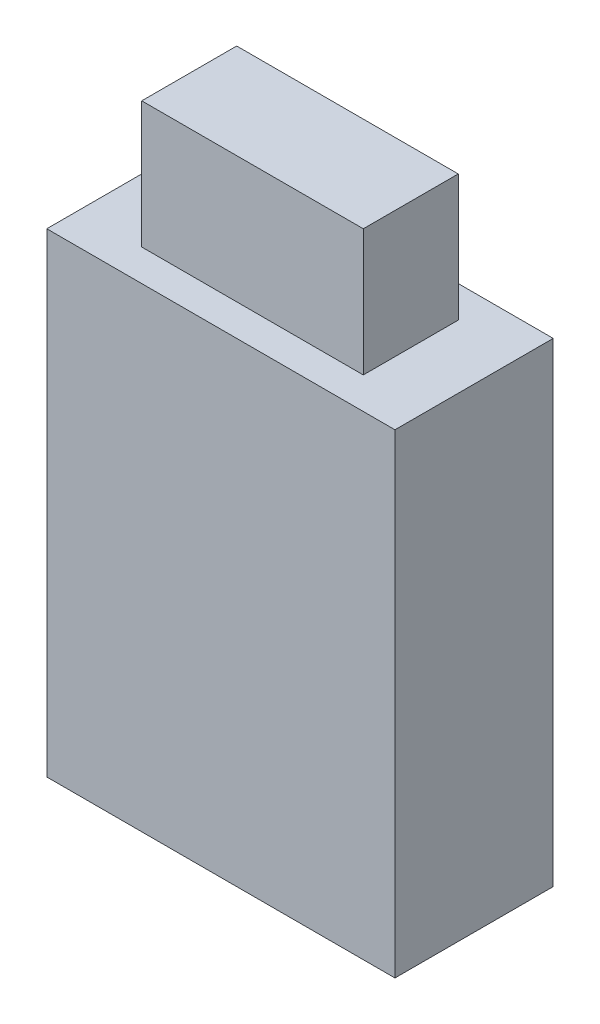
ISO-10303-21;
HEADER;
FILE_DESCRIPTION(('STEP AP214'),'2;1');
FILE_NAME('part.step','',(''),(''),'','','');
FILE_SCHEMA(('AUTOMOTIVE_DESIGN { 1 0 10303 214 1 1 1 1 }'));
ENDSEC;
DATA;
#1=APPLICATION_CONTEXT('core data for automotive mechanical design processes');
#2=APPLICATION_PROTOCOL_DEFINITION('international standard','automotive_design',2000,#1);
#3=PRODUCT_CONTEXT('',#1,'mechanical');
#4=PRODUCT('Part','Part','',(#3));
#5=PRODUCT_RELATED_PRODUCT_CATEGORY('part','',(#4));
#6=PRODUCT_DEFINITION_FORMATION('','',#4);
#7=PRODUCT_DEFINITION_CONTEXT('part definition',#1,'design');
#8=PRODUCT_DEFINITION('design','',#6,#7);
#9=PRODUCT_DEFINITION_SHAPE('','',#8);
#10=(LENGTH_UNIT() NAMED_UNIT(*) SI_UNIT(.MILLI.,.METRE.));
#11=(NAMED_UNIT(*) PLANE_ANGLE_UNIT() SI_UNIT($,.RADIAN.));
#12=(NAMED_UNIT(*) SI_UNIT($,.STERADIAN.) SOLID_ANGLE_UNIT());
#13=UNCERTAINTY_MEASURE_WITH_UNIT(LENGTH_MEASURE(1.E-05),#10,'distance_accuracy_value','');
#14=(GEOMETRIC_REPRESENTATION_CONTEXT(3) GLOBAL_UNCERTAINTY_ASSIGNED_CONTEXT((#13)) GLOBAL_UNIT_ASSIGNED_CONTEXT((#10,
#11,#12)) REPRESENTATION_CONTEXT('',''));
#15=CARTESIAN_POINT('',(0.,0.,0.));
#16=DIRECTION('',(0.,0.,1.));
#17=DIRECTION('',(1.,0.,0.));
#18=AXIS2_PLACEMENT_3D('',#15,#16,#17);
#19=CARTESIAN_POINT('',(30.,158.,66.));
#20=DIRECTION('',(1.,0.,0.));
#21=DIRECTION('',(0.,0.,-1.));
#22=AXIS2_PLACEMENT_3D('',#19,#20,#21);
#23=PLANE('',#22);
#24=DIRECTION('',(0.,-1.,0.));
#25=VECTOR('',#24,1.);
#26=CARTESIAN_POINT('',(30.,158.,56.));
#27=LINE('',#26,#25);
#28=CARTESIAN_POINT('',(30.,188.,56.));
#29=VERTEX_POINT('',#28);
#30=CARTESIAN_POINT('',(30.,158.,56.));
#31=VERTEX_POINT('',#30);
#32=EDGE_CURVE('E130',#29,#31,#27,.T.);
#33=ORIENTED_EDGE('',*,*,#32,.T.);
#34=DIRECTION('',(0.,0.,-1.));
#35=VECTOR('',#34,1.);
#36=CARTESIAN_POINT('',(30.,158.,66.));
#37=LINE('',#36,#35);
#38=CARTESIAN_POINT('',(30.,158.,66.));
#39=VERTEX_POINT('',#38);
#40=EDGE_CURVE('E11',#39,#31,#37,.T.);
#41=ORIENTED_EDGE('',*,*,#40,.F.);
#42=DIRECTION('',(0.,-1.,0.));
#43=VECTOR('',#42,1.);
#44=CARTESIAN_POINT('',(30.,158.,66.));
#45=LINE('',#44,#43);
#46=CARTESIAN_POINT('',(30.,188.,66.));
#47=VERTEX_POINT('',#46);
#48=EDGE_CURVE('E152',#47,#39,#45,.T.);
#49=ORIENTED_EDGE('',*,*,#48,.F.);
#50=DIRECTION('',(0.,0.,-1.));
#51=VECTOR('',#50,1.);
#52=CARTESIAN_POINT('',(30.,188.,66.));
#53=LINE('',#52,#51);
#54=EDGE_CURVE('E158',#47,#29,#53,.T.);
#55=ORIENTED_EDGE('',*,*,#54,.T.);
#56=EDGE_LOOP('',(#33,#41,#49,#55));
#57=FACE_BOUND('',#56,.T.);
#58=ADVANCED_FACE('F41',(#57),#23,.F.);
#59=CARTESIAN_POINT('',(30.,158.,66.));
#60=DIRECTION('',(0.,1.,0.));
#61=DIRECTION('',(0.,0.,1.));
#62=AXIS2_PLACEMENT_3D('',#59,#60,#61);
#63=PLANE('',#62);
#64=DIRECTION('',(1.,0.,0.));
#65=VECTOR('',#64,1.);
#66=CARTESIAN_POINT('',(30.,158.,56.));
#67=LINE('',#66,#65);
#68=CARTESIAN_POINT('',(52.,158.,56.));
#69=VERTEX_POINT('',#68);
#70=EDGE_CURVE('E161',#31,#69,#67,.T.);
#71=ORIENTED_EDGE('',*,*,#70,.T.);
#72=DIRECTION('',(0.,0.,-1.));
#73=VECTOR('',#72,1.);
#74=CARTESIAN_POINT('',(52.,158.,66.));
#75=LINE('',#74,#73);
#76=CARTESIAN_POINT('',(52.,158.,66.));
#77=VERTEX_POINT('',#76);
#78=EDGE_CURVE('E48',#77,#69,#75,.T.);
#79=ORIENTED_EDGE('',*,*,#78,.F.);
#80=DIRECTION('',(1.,0.,0.));
#81=VECTOR('',#80,1.);
#82=CARTESIAN_POINT('',(30.,158.,66.));
#83=LINE('',#82,#81);
#84=EDGE_CURVE('E92',#39,#77,#83,.T.);
#85=ORIENTED_EDGE('',*,*,#84,.F.);
#86=ORIENTED_EDGE('',*,*,#40,.T.);
#87=EDGE_LOOP('',(#71,#79,#85,#86));
#88=FACE_BOUND('',#87,.T.);
#89=ADVANCED_FACE('F190',(#88),#63,.F.);
#90=CARTESIAN_POINT('',(52.,158.,66.));
#91=DIRECTION('',(-1.,0.,0.));
#92=DIRECTION('',(0.,0.,1.));
#93=AXIS2_PLACEMENT_3D('',#90,#91,#92);
#94=PLANE('',#93);
#95=DIRECTION('',(0.,1.,0.));
#96=VECTOR('',#95,1.);
#97=CARTESIAN_POINT('',(52.,158.,56.));
#98=LINE('',#97,#96);
#99=CARTESIAN_POINT('',(52.,188.,56.));
#100=VERTEX_POINT('',#99);
#101=EDGE_CURVE('E163',#69,#100,#98,.T.);
#102=ORIENTED_EDGE('',*,*,#101,.T.);
#103=DIRECTION('',(0.,0.,-1.));
#104=VECTOR('',#103,1.);
#105=CARTESIAN_POINT('',(52.,188.,66.));
#106=LINE('',#105,#104);
#107=CARTESIAN_POINT('',(52.,188.,66.));
#108=VERTEX_POINT('',#107);
#109=EDGE_CURVE('E167',#108,#100,#106,.T.);
#110=ORIENTED_EDGE('',*,*,#109,.F.);
#111=DIRECTION('',(0.,1.,0.));
#112=VECTOR('',#111,1.);
#113=CARTESIAN_POINT('',(52.,158.,66.));
#114=LINE('',#113,#112);
#115=EDGE_CURVE('E155',#77,#108,#114,.T.);
#116=ORIENTED_EDGE('',*,*,#115,.F.);
#117=ORIENTED_EDGE('',*,*,#78,.T.);
#118=EDGE_LOOP('',(#102,#110,#116,#117));
#119=FACE_BOUND('',#118,.T.);
#120=ADVANCED_FACE('F172',(#119),#94,.F.);
#121=CARTESIAN_POINT('',(30.,188.,66.));
#122=DIRECTION('',(0.,-1.,0.));
#123=DIRECTION('',(0.,0.,-1.));
#124=AXIS2_PLACEMENT_3D('',#121,#122,#123);
#125=PLANE('',#124);
#126=DIRECTION('',(0.,0.,-1.));
#127=VECTOR('',#126,1.);
#128=CARTESIAN_POINT('',(34.,188.,64.));
#129=LINE('',#128,#127);
#130=CARTESIAN_POINT('',(34.,188.,64.));
#131=VERTEX_POINT('',#130);
#132=CARTESIAN_POINT('',(34.,188.,58.));
#133=VERTEX_POINT('',#132);
#134=EDGE_CURVE('E126',#131,#133,#129,.T.);
#135=ORIENTED_EDGE('',*,*,#134,.T.);
#136=DIRECTION('',(1.,0.,0.));
#137=VECTOR('',#136,1.);
#138=CARTESIAN_POINT('',(34.,188.,58.));
#139=LINE('',#138,#137);
#140=CARTESIAN_POINT('',(48.,188.,58.));
#141=VERTEX_POINT('',#140);
#142=EDGE_CURVE('E142',#133,#141,#139,.T.);
#143=ORIENTED_EDGE('',*,*,#142,.T.);
#144=DIRECTION('',(0.,0.,-1.));
#145=VECTOR('',#144,1.);
#146=CARTESIAN_POINT('',(48.,188.,64.));
#147=LINE('',#146,#145);
#148=CARTESIAN_POINT('',(48.,188.,64.));
#149=VERTEX_POINT('',#148);
#150=EDGE_CURVE('E131',#149,#141,#147,.T.);
#151=ORIENTED_EDGE('',*,*,#150,.F.);
#152=DIRECTION('',(1.,0.,0.));
#153=VECTOR('',#152,1.);
#154=CARTESIAN_POINT('',(34.,188.,64.));
#155=LINE('',#154,#153);
#156=EDGE_CURVE('E118',#131,#149,#155,.T.);
#157=ORIENTED_EDGE('',*,*,#156,.F.);
#158=EDGE_LOOP('',(#135,#143,#151,#157));
#159=FACE_BOUND('',#158,.T.);
#160=DIRECTION('',(-1.,0.,0.));
#161=VECTOR('',#160,1.);
#162=CARTESIAN_POINT('',(30.,188.,56.));
#163=LINE('',#162,#161);
#164=EDGE_CURVE('E85',#100,#29,#163,.T.);
#165=ORIENTED_EDGE('',*,*,#164,.T.);
#166=ORIENTED_EDGE('',*,*,#54,.F.);
#167=DIRECTION('',(-1.,0.,0.));
#168=VECTOR('',#167,1.);
#169=CARTESIAN_POINT('',(30.,188.,66.));
#170=LINE('',#169,#168);
#171=EDGE_CURVE('E64',#108,#47,#170,.T.);
#172=ORIENTED_EDGE('',*,*,#171,.F.);
#173=ORIENTED_EDGE('',*,*,#109,.T.);
#174=EDGE_LOOP('',(#165,#166,#172,#173));
#175=FACE_BOUND('',#174,.T.);
#176=ADVANCED_FACE('F134',(#159,#175),#125,.F.);
#177=CARTESIAN_POINT('',(0.,0.,66.));
#178=DIRECTION('',(0.,0.,-1.));
#179=DIRECTION('',(-1.,0.,0.));
#180=AXIS2_PLACEMENT_3D('',#177,#178,#179);
#181=PLANE('',#180);
#182=ORIENTED_EDGE('',*,*,#48,.T.);
#183=ORIENTED_EDGE('',*,*,#84,.T.);
#184=ORIENTED_EDGE('',*,*,#115,.T.);
#185=ORIENTED_EDGE('',*,*,#171,.T.);
#186=EDGE_LOOP('',(#182,#183,#184,#185));
#187=FACE_BOUND('',#186,.T.);
#188=ADVANCED_FACE('F181',(#187),#181,.F.);
#189=CARTESIAN_POINT('',(0.,0.,56.));
#190=DIRECTION('',(0.,0.,-1.));
#191=DIRECTION('',(-1.,0.,0.));
#192=AXIS2_PLACEMENT_3D('',#189,#190,#191);
#193=PLANE('',#192);
#194=ORIENTED_EDGE('',*,*,#32,.F.);
#195=ORIENTED_EDGE('',*,*,#164,.F.);
#196=ORIENTED_EDGE('',*,*,#101,.F.);
#197=ORIENTED_EDGE('',*,*,#70,.F.);
#198=EDGE_LOOP('',(#194,#195,#196,#197));
#199=FACE_BOUND('',#198,.T.);
#200=ADVANCED_FACE('F176',(#199),#193,.T.);
#201=CARTESIAN_POINT('',(34.,188.,64.));
#202=DIRECTION('',(1.,0.,0.));
#203=DIRECTION('',(0.,0.,-1.));
#204=AXIS2_PLACEMENT_3D('',#201,#202,#203);
#205=PLANE('',#204);
#206=DIRECTION('',(0.,-1.,0.));
#207=VECTOR('',#206,1.);
#208=CARTESIAN_POINT('',(34.,188.,58.));
#209=LINE('',#208,#207);
#210=CARTESIAN_POINT('',(34.,196.,58.));
#211=VERTEX_POINT('',#210);
#212=EDGE_CURVE('E55',#211,#133,#209,.T.);
#213=ORIENTED_EDGE('',*,*,#212,.T.);
#214=ORIENTED_EDGE('',*,*,#134,.F.);
#215=DIRECTION('',(0.,-1.,0.));
#216=VECTOR('',#215,1.);
#217=CARTESIAN_POINT('',(34.,188.,64.));
#218=LINE('',#217,#216);
#219=CARTESIAN_POINT('',(34.,196.,64.));
#220=VERTEX_POINT('',#219);
#221=EDGE_CURVE('E115',#220,#131,#218,.T.);
#222=ORIENTED_EDGE('',*,*,#221,.F.);
#223=DIRECTION('',(0.,0.,-1.));
#224=VECTOR('',#223,1.);
#225=CARTESIAN_POINT('',(34.,196.,64.));
#226=LINE('',#225,#224);
#227=EDGE_CURVE('E140',#220,#211,#226,.T.);
#228=ORIENTED_EDGE('',*,*,#227,.T.);
#229=EDGE_LOOP('',(#213,#214,#222,#228));
#230=FACE_BOUND('',#229,.T.);
#231=ADVANCED_FACE('F127',(#230),#205,.F.);
#232=CARTESIAN_POINT('',(48.,188.,64.));
#233=DIRECTION('',(-1.,0.,0.));
#234=DIRECTION('',(0.,0.,1.));
#235=AXIS2_PLACEMENT_3D('',#232,#233,#234);
#236=PLANE('',#235);
#237=DIRECTION('',(0.,1.,0.));
#238=VECTOR('',#237,1.);
#239=CARTESIAN_POINT('',(48.,188.,58.));
#240=LINE('',#239,#238);
#241=CARTESIAN_POINT('',(48.,196.,58.));
#242=VERTEX_POINT('',#241);
#243=EDGE_CURVE('E144',#141,#242,#240,.T.);
#244=ORIENTED_EDGE('',*,*,#243,.T.);
#245=DIRECTION('',(0.,0.,-1.));
#246=VECTOR('',#245,1.);
#247=CARTESIAN_POINT('',(48.,196.,64.));
#248=LINE('',#247,#246);
#249=CARTESIAN_POINT('',(48.,196.,64.));
#250=VERTEX_POINT('',#249);
#251=EDGE_CURVE('E148',#250,#242,#248,.T.);
#252=ORIENTED_EDGE('',*,*,#251,.F.);
#253=DIRECTION('',(0.,1.,0.));
#254=VECTOR('',#253,1.);
#255=CARTESIAN_POINT('',(48.,188.,64.));
#256=LINE('',#255,#254);
#257=EDGE_CURVE('E135',#149,#250,#256,.T.);
#258=ORIENTED_EDGE('',*,*,#257,.F.);
#259=ORIENTED_EDGE('',*,*,#150,.T.);
#260=EDGE_LOOP('',(#244,#252,#258,#259));
#261=FACE_BOUND('',#260,.T.);
#262=ADVANCED_FACE('F223',(#261),#236,.F.);
#263=CARTESIAN_POINT('',(34.,196.,64.));
#264=DIRECTION('',(0.,-1.,0.));
#265=DIRECTION('',(0.,0.,-1.));
#266=AXIS2_PLACEMENT_3D('',#263,#264,#265);
#267=PLANE('',#266);
#268=DIRECTION('',(-1.,0.,0.));
#269=VECTOR('',#268,1.);
#270=CARTESIAN_POINT('',(34.,196.,58.));
#271=LINE('',#270,#269);
#272=EDGE_CURVE('E123',#242,#211,#271,.T.);
#273=ORIENTED_EDGE('',*,*,#272,.T.);
#274=ORIENTED_EDGE('',*,*,#227,.F.);
#275=DIRECTION('',(-1.,0.,0.));
#276=VECTOR('',#275,1.);
#277=CARTESIAN_POINT('',(34.,196.,64.));
#278=LINE('',#277,#276);
#279=EDGE_CURVE('E121',#250,#220,#278,.T.);
#280=ORIENTED_EDGE('',*,*,#279,.F.);
#281=ORIENTED_EDGE('',*,*,#251,.T.);
#282=EDGE_LOOP('',(#273,#274,#280,#281));
#283=FACE_BOUND('',#282,.T.);
#284=ADVANCED_FACE('F232',(#283),#267,.F.);
#285=CARTESIAN_POINT('',(0.,0.,64.));
#286=DIRECTION('',(0.,0.,-1.));
#287=DIRECTION('',(-1.,0.,0.));
#288=AXIS2_PLACEMENT_3D('',#285,#286,#287);
#289=PLANE('',#288);
#290=ORIENTED_EDGE('',*,*,#221,.T.);
#291=ORIENTED_EDGE('',*,*,#156,.T.);
#292=ORIENTED_EDGE('',*,*,#257,.T.);
#293=ORIENTED_EDGE('',*,*,#279,.T.);
#294=EDGE_LOOP('',(#290,#291,#292,#293));
#295=FACE_BOUND('',#294,.T.);
#296=ADVANCED_FACE('F116',(#295),#289,.F.);
#297=CARTESIAN_POINT('',(0.,0.,58.));
#298=DIRECTION('',(0.,0.,-1.));
#299=DIRECTION('',(-1.,0.,0.));
#300=AXIS2_PLACEMENT_3D('',#297,#298,#299);
#301=PLANE('',#300);
#302=ORIENTED_EDGE('',*,*,#212,.F.);
#303=ORIENTED_EDGE('',*,*,#272,.F.);
#304=ORIENTED_EDGE('',*,*,#243,.F.);
#305=ORIENTED_EDGE('',*,*,#142,.F.);
#306=EDGE_LOOP('',(#302,#303,#304,#305));
#307=FACE_BOUND('',#306,.T.);
#308=ADVANCED_FACE('F251',(#307),#301,.T.);
#309=CLOSED_SHELL('',(#58,#89,#120,#176,#188,#200,#231,#262,#284,#296,#308));
#310=MANIFOLD_SOLID_BREP('B2',#309);
#311=ADVANCED_BREP_SHAPE_REPRESENTATION('',(#18,#310),#14);
#312=SHAPE_DEFINITION_REPRESENTATION(#9,#311);
ENDSEC;
END-ISO-10303-21;
